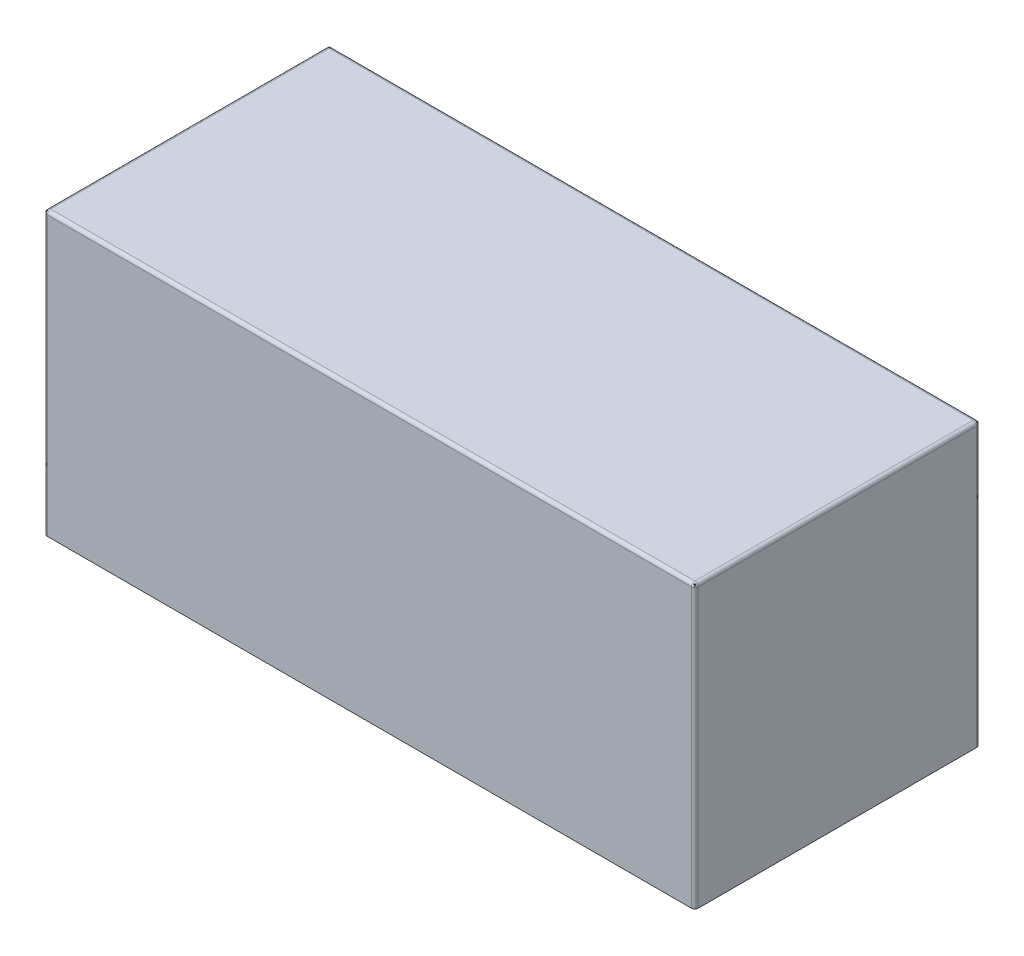
ISO-10303-21;
HEADER;
FILE_DESCRIPTION(('STEP AP214'),'2;1');
FILE_NAME('part.step','',(''),(''),'','','');
FILE_SCHEMA(('AUTOMOTIVE_DESIGN { 1 0 10303 214 1 1 1 1 }'));
ENDSEC;
DATA;
#1=APPLICATION_CONTEXT('core data for automotive mechanical design processes');
#2=APPLICATION_PROTOCOL_DEFINITION('international standard','automotive_design',2000,#1);
#3=PRODUCT_CONTEXT('',#1,'mechanical');
#4=PRODUCT('Part','Part','',(#3));
#5=PRODUCT_RELATED_PRODUCT_CATEGORY('part','',(#4));
#6=PRODUCT_DEFINITION_FORMATION('','',#4);
#7=PRODUCT_DEFINITION_CONTEXT('part definition',#1,'design');
#8=PRODUCT_DEFINITION('design','',#6,#7);
#9=PRODUCT_DEFINITION_SHAPE('','',#8);
#10=(LENGTH_UNIT() NAMED_UNIT(*) SI_UNIT(.MILLI.,.METRE.));
#11=(NAMED_UNIT(*) PLANE_ANGLE_UNIT() SI_UNIT($,.RADIAN.));
#12=(NAMED_UNIT(*) SI_UNIT($,.STERADIAN.) SOLID_ANGLE_UNIT());
#13=UNCERTAINTY_MEASURE_WITH_UNIT(LENGTH_MEASURE(1.E-05),#10,'distance_accuracy_value','');
#14=(GEOMETRIC_REPRESENTATION_CONTEXT(3) GLOBAL_UNCERTAINTY_ASSIGNED_CONTEXT((#13)) GLOBAL_UNIT_ASSIGNED_CONTEXT((#10,
#11,#12)) REPRESENTATION_CONTEXT('',''));
#15=CARTESIAN_POINT('',(0.,0.,0.));
#16=DIRECTION('',(0.,0.,1.));
#17=DIRECTION('',(1.,0.,0.));
#18=AXIS2_PLACEMENT_3D('',#15,#16,#17);
#19=CARTESIAN_POINT('',(483.4125,420.,-210.9125));
#20=DIRECTION('',(-1.,0.,0.));
#21=DIRECTION('',(0.,0.,1.));
#22=AXIS2_PLACEMENT_3D('',#19,#20,#21);
#23=PLANE('',#22);
#24=DIRECTION('',(0.,-1.,0.));
#25=VECTOR('',#24,1.);
#26=CARTESIAN_POINT('',(483.4125,420.,210.9125));
#27=LINE('',#26,#25);
#28=CARTESIAN_POINT('',(483.4125,418.4125,210.9125));
#29=VERTEX_POINT('',#28);
#30=CARTESIAN_POINT('',(483.4125,0.,210.9125));
#31=VERTEX_POINT('',#30);
#32=EDGE_CURVE('E160',#29,#31,#27,.T.);
#33=ORIENTED_EDGE('',*,*,#32,.F.);
#34=DIRECTION('',(0.,0.,-1.));
#35=VECTOR('',#34,1.);
#36=CARTESIAN_POINT('',(483.4125,418.4125,-210.9125));
#37=LINE('',#36,#35);
#38=CARTESIAN_POINT('',(483.4125,418.4125,-210.9125));
#39=VERTEX_POINT('',#38);
#40=EDGE_CURVE('E140',#29,#39,#37,.T.);
#41=ORIENTED_EDGE('',*,*,#40,.T.);
#42=DIRECTION('',(0.,-1.,0.));
#43=VECTOR('',#42,1.);
#44=CARTESIAN_POINT('',(483.4125,420.,-210.9125));
#45=LINE('',#44,#43);
#46=CARTESIAN_POINT('',(483.4125,0.,-210.9125));
#47=VERTEX_POINT('',#46);
#48=EDGE_CURVE('E162',#39,#47,#45,.T.);
#49=ORIENTED_EDGE('',*,*,#48,.T.);
#50=DIRECTION('',(0.,0.,-1.));
#51=VECTOR('',#50,1.);
#52=CARTESIAN_POINT('',(483.4125,0.,-210.9125));
#53=LINE('',#52,#51);
#54=EDGE_CURVE('E502',#31,#47,#53,.T.);
#55=ORIENTED_EDGE('',*,*,#54,.F.);
#56=EDGE_LOOP('',(#33,#41,#49,#55));
#57=FACE_BOUND('',#56,.T.);
#58=ADVANCED_FACE('F33',(#57),#23,.T.);
#59=CARTESIAN_POINT('',(-483.4125,420.,-210.9125));
#60=DIRECTION('',(0.,0.,1.));
#61=DIRECTION('',(1.,0.,0.));
#62=AXIS2_PLACEMENT_3D('',#59,#60,#61);
#63=PLANE('',#62);
#64=ORIENTED_EDGE('',*,*,#48,.F.);
#65=DIRECTION('',(-1.,0.,0.));
#66=VECTOR('',#65,1.);
#67=CARTESIAN_POINT('',(-483.4125,418.4125,-210.9125));
#68=LINE('',#67,#66);
#69=CARTESIAN_POINT('',(-483.4125,418.4125,-210.9125));
#70=VERTEX_POINT('',#69);
#71=EDGE_CURVE('E154',#39,#70,#68,.T.);
#72=ORIENTED_EDGE('',*,*,#71,.T.);
#73=DIRECTION('',(0.,-1.,0.));
#74=VECTOR('',#73,1.);
#75=CARTESIAN_POINT('',(-483.4125,420.,-210.9125));
#76=LINE('',#75,#74);
#77=CARTESIAN_POINT('',(-483.4125,0.,-210.9125));
#78=VERTEX_POINT('',#77);
#79=EDGE_CURVE('E153',#70,#78,#76,.T.);
#80=ORIENTED_EDGE('',*,*,#79,.T.);
#81=DIRECTION('',(-1.,0.,0.));
#82=VECTOR('',#81,1.);
#83=CARTESIAN_POINT('',(-483.4125,0.,-210.9125));
#84=LINE('',#83,#82);
#85=EDGE_CURVE('E505',#47,#78,#84,.T.);
#86=ORIENTED_EDGE('',*,*,#85,.F.);
#87=EDGE_LOOP('',(#64,#72,#80,#86));
#88=FACE_BOUND('',#87,.T.);
#89=ADVANCED_FACE('F314',(#88),#63,.T.);
#90=CARTESIAN_POINT('',(-483.4125,420.,-210.9125));
#91=DIRECTION('',(1.,0.,0.));
#92=DIRECTION('',(0.,0.,-1.));
#93=AXIS2_PLACEMENT_3D('',#90,#91,#92);
#94=PLANE('',#93);
#95=ORIENTED_EDGE('',*,*,#79,.F.);
#96=DIRECTION('',(0.,0.,1.));
#97=VECTOR('',#96,1.);
#98=CARTESIAN_POINT('',(-483.4125,418.4125,-210.9125));
#99=LINE('',#98,#97);
#100=CARTESIAN_POINT('',(-483.4125,418.4125,210.9125));
#101=VERTEX_POINT('',#100);
#102=EDGE_CURVE('E137',#70,#101,#99,.T.);
#103=ORIENTED_EDGE('',*,*,#102,.T.);
#104=DIRECTION('',(0.,-1.,0.));
#105=VECTOR('',#104,1.);
#106=CARTESIAN_POINT('',(-483.4125,420.,210.9125));
#107=LINE('',#106,#105);
#108=CARTESIAN_POINT('',(-483.4125,0.,210.9125));
#109=VERTEX_POINT('',#108);
#110=EDGE_CURVE('E151',#101,#109,#107,.T.);
#111=ORIENTED_EDGE('',*,*,#110,.T.);
#112=DIRECTION('',(0.,0.,1.));
#113=VECTOR('',#112,1.);
#114=CARTESIAN_POINT('',(-483.4125,0.,-210.9125));
#115=LINE('',#114,#113);
#116=EDGE_CURVE('E507',#78,#109,#115,.T.);
#117=ORIENTED_EDGE('',*,*,#116,.F.);
#118=EDGE_LOOP('',(#95,#103,#111,#117));
#119=FACE_BOUND('',#118,.T.);
#120=ADVANCED_FACE('F149',(#119),#94,.T.);
#121=CARTESIAN_POINT('',(-483.4125,420.,210.9125));
#122=DIRECTION('',(0.,0.,-1.));
#123=DIRECTION('',(-1.,0.,0.));
#124=AXIS2_PLACEMENT_3D('',#121,#122,#123);
#125=PLANE('',#124);
#126=ORIENTED_EDGE('',*,*,#110,.F.);
#127=DIRECTION('',(1.,0.,0.));
#128=VECTOR('',#127,1.);
#129=CARTESIAN_POINT('',(-483.4125,418.4125,210.9125));
#130=LINE('',#129,#128);
#131=EDGE_CURVE('E134',#101,#29,#130,.T.);
#132=ORIENTED_EDGE('',*,*,#131,.T.);
#133=ORIENTED_EDGE('',*,*,#32,.T.);
#134=DIRECTION('',(1.,0.,0.));
#135=VECTOR('',#134,1.);
#136=CARTESIAN_POINT('',(-483.4125,0.,210.9125));
#137=LINE('',#136,#135);
#138=EDGE_CURVE('E158',#109,#31,#137,.T.);
#139=ORIENTED_EDGE('',*,*,#138,.F.);
#140=EDGE_LOOP('',(#126,#132,#133,#139));
#141=FACE_BOUND('',#140,.T.);
#142=ADVANCED_FACE('F156',(#141),#125,.T.);
#143=CARTESIAN_POINT('',(0.,420.,0.));
#144=DIRECTION('',(0.,1.,0.));
#145=DIRECTION('',(0.,0.,1.));
#146=AXIS2_PLACEMENT_3D('',#143,#144,#145);
#147=PLANE('',#146);
#148=DIRECTION('',(0.,0.,1.));
#149=VECTOR('',#148,1.);
#150=CARTESIAN_POINT('',(-480.,420.,212.5));
#151=LINE('',#150,#149);
#152=CARTESIAN_POINT('',(-480.,420.,-207.5));
#153=VERTEX_POINT('',#152);
#154=CARTESIAN_POINT('',(-480.,420.,207.5));
#155=VERTEX_POINT('',#154);
#156=EDGE_CURVE('E181',#153,#155,#151,.T.);
#157=ORIENTED_EDGE('',*,*,#156,.T.);
#158=DIRECTION('',(1.,0.,0.));
#159=VECTOR('',#158,1.);
#160=CARTESIAN_POINT('',(485.,420.,207.5));
#161=LINE('',#160,#159);
#162=CARTESIAN_POINT('',(480.,420.,207.5));
#163=VERTEX_POINT('',#162);
#164=EDGE_CURVE('E183',#155,#163,#161,.T.);
#165=ORIENTED_EDGE('',*,*,#164,.T.);
#166=DIRECTION('',(0.,0.,-1.));
#167=VECTOR('',#166,1.);
#168=CARTESIAN_POINT('',(480.,420.,-212.5));
#169=LINE('',#168,#167);
#170=CARTESIAN_POINT('',(480.,420.,-207.5));
#171=VERTEX_POINT('',#170);
#172=EDGE_CURVE('E144',#163,#171,#169,.T.);
#173=ORIENTED_EDGE('',*,*,#172,.T.);
#174=DIRECTION('',(-1.,0.,0.));
#175=VECTOR('',#174,1.);
#176=CARTESIAN_POINT('',(-485.,420.,-207.5));
#177=LINE('',#176,#175);
#178=EDGE_CURVE('E179',#171,#153,#177,.T.);
#179=ORIENTED_EDGE('',*,*,#178,.T.);
#180=EDGE_LOOP('',(#157,#165,#173,#179));
#181=FACE_BOUND('',#180,.T.);
#182=ADVANCED_FACE('F260',(#181),#147,.T.);
#183=CARTESIAN_POINT('',(0.,0.,0.));
#184=DIRECTION('',(0.,1.,0.));
#185=DIRECTION('',(0.,0.,1.));
#186=AXIS2_PLACEMENT_3D('',#183,#184,#185);
#187=PLANE('',#186);
#188=DIRECTION('',(0.,0.,-1.));
#189=VECTOR('',#188,1.);
#190=CARTESIAN_POINT('',(485.,0.,-212.5));
#191=LINE('',#190,#189);
#192=CARTESIAN_POINT('',(485.,0.,207.5));
#193=VERTEX_POINT('',#192);
#194=CARTESIAN_POINT('',(485.,0.,-207.5));
#195=VERTEX_POINT('',#194);
#196=EDGE_CURVE('E168',#193,#195,#191,.T.);
#197=ORIENTED_EDGE('',*,*,#196,.F.);
#198=CARTESIAN_POINT('',(480.,0.,207.5));
#199=DIRECTION('',(0.,1.,0.));
#200=DIRECTION('',(0.,0.,1.));
#201=AXIS2_PLACEMENT_3D('',#198,#199,#200);
#202=CIRCLE('',#201,5.);
#203=CARTESIAN_POINT('',(480.,0.,212.5));
#204=VERTEX_POINT('',#203);
#205=EDGE_CURVE('E11',#193,#204,#202,.F.);
#206=ORIENTED_EDGE('',*,*,#205,.T.);
#207=DIRECTION('',(1.,0.,0.));
#208=VECTOR('',#207,1.);
#209=CARTESIAN_POINT('',(-485.,0.,212.5));
#210=LINE('',#209,#208);
#211=CARTESIAN_POINT('',(-480.,0.,212.5));
#212=VERTEX_POINT('',#211);
#213=EDGE_CURVE('E145',#212,#204,#210,.T.);
#214=ORIENTED_EDGE('',*,*,#213,.F.);
#215=CARTESIAN_POINT('',(-480.,0.,207.5));
#216=DIRECTION('',(0.,1.,0.));
#217=DIRECTION('',(0.,0.,1.));
#218=AXIS2_PLACEMENT_3D('',#215,#216,#217);
#219=CIRCLE('',#218,5.);
#220=CARTESIAN_POINT('',(-485.,0.,207.5));
#221=VERTEX_POINT('',#220);
#222=EDGE_CURVE('E42',#212,#221,#219,.F.);
#223=ORIENTED_EDGE('',*,*,#222,.T.);
#224=DIRECTION('',(0.,0.,1.));
#225=VECTOR('',#224,1.);
#226=CARTESIAN_POINT('',(-485.,0.,-212.5));
#227=LINE('',#226,#225);
#228=CARTESIAN_POINT('',(-485.,0.,-207.5));
#229=VERTEX_POINT('',#228);
#230=EDGE_CURVE('E173',#229,#221,#227,.T.);
#231=ORIENTED_EDGE('',*,*,#230,.F.);
#232=CARTESIAN_POINT('',(-480.,0.,-207.5));
#233=DIRECTION('',(0.,1.,0.));
#234=DIRECTION('',(0.,0.,1.));
#235=AXIS2_PLACEMENT_3D('',#232,#233,#234);
#236=CIRCLE('',#235,5.);
#237=CARTESIAN_POINT('',(-480.,0.,-212.5));
#238=VERTEX_POINT('',#237);
#239=EDGE_CURVE('E211',#229,#238,#236,.F.);
#240=ORIENTED_EDGE('',*,*,#239,.T.);
#241=DIRECTION('',(-1.,0.,0.));
#242=VECTOR('',#241,1.);
#243=CARTESIAN_POINT('',(-485.,0.,-212.5));
#244=LINE('',#243,#242);
#245=CARTESIAN_POINT('',(480.,0.,-212.5));
#246=VERTEX_POINT('',#245);
#247=EDGE_CURVE('E170',#246,#238,#244,.T.);
#248=ORIENTED_EDGE('',*,*,#247,.F.);
#249=CARTESIAN_POINT('',(480.,0.,-207.5));
#250=DIRECTION('',(0.,1.,0.));
#251=DIRECTION('',(0.,0.,1.));
#252=AXIS2_PLACEMENT_3D('',#249,#250,#251);
#253=CIRCLE('',#252,5.);
#254=EDGE_CURVE('E209',#246,#195,#253,.F.);
#255=ORIENTED_EDGE('',*,*,#254,.T.);
#256=EDGE_LOOP('',(#197,#206,#214,#223,#231,#240,#248,#255));
#257=FACE_BOUND('',#256,.T.);
#258=ORIENTED_EDGE('',*,*,#54,.T.);
#259=ORIENTED_EDGE('',*,*,#85,.T.);
#260=ORIENTED_EDGE('',*,*,#116,.T.);
#261=ORIENTED_EDGE('',*,*,#138,.T.);
#262=EDGE_LOOP('',(#258,#259,#260,#261));
#263=FACE_BOUND('',#262,.T.);
#264=ADVANCED_FACE('F278',(#257,#263),#187,.F.);
#265=CARTESIAN_POINT('',(485.,420.,-212.5));
#266=DIRECTION('',(-1.,0.,0.));
#267=DIRECTION('',(0.,0.,1.));
#268=AXIS2_PLACEMENT_3D('',#265,#266,#267);
#269=PLANE('',#268);
#270=DIRECTION('',(0.,0.,-1.));
#271=VECTOR('',#270,1.);
#272=CARTESIAN_POINT('',(485.,415.,212.5));
#273=LINE('',#272,#271);
#274=CARTESIAN_POINT('',(485.,415.,-207.5));
#275=VERTEX_POINT('',#274);
#276=CARTESIAN_POINT('',(485.,415.,207.5));
#277=VERTEX_POINT('',#276);
#278=EDGE_CURVE('E50',#275,#277,#273,.F.);
#279=ORIENTED_EDGE('',*,*,#278,.T.);
#280=DIRECTION('',(0.,-1.,0.));
#281=VECTOR('',#280,1.);
#282=CARTESIAN_POINT('',(485.,420.,207.5));
#283=LINE('',#282,#281);
#284=EDGE_CURVE('E207',#277,#193,#283,.T.);
#285=ORIENTED_EDGE('',*,*,#284,.T.);
#286=ORIENTED_EDGE('',*,*,#196,.T.);
#287=DIRECTION('',(0.,-1.,0.));
#288=VECTOR('',#287,1.);
#289=CARTESIAN_POINT('',(485.,420.,-207.5));
#290=LINE('',#289,#288);
#291=EDGE_CURVE('E55',#195,#275,#290,.F.);
#292=ORIENTED_EDGE('',*,*,#291,.T.);
#293=EDGE_LOOP('',(#279,#285,#286,#292));
#294=FACE_BOUND('',#293,.T.);
#295=ADVANCED_FACE('F281',(#294),#269,.F.);
#296=CARTESIAN_POINT('',(-485.,420.,-212.5));
#297=DIRECTION('',(0.,0.,1.));
#298=DIRECTION('',(1.,0.,0.));
#299=AXIS2_PLACEMENT_3D('',#296,#297,#298);
#300=PLANE('',#299);
#301=ORIENTED_EDGE('',*,*,#247,.T.);
#302=DIRECTION('',(0.,-1.,0.));
#303=VECTOR('',#302,1.);
#304=CARTESIAN_POINT('',(-480.,420.,-212.5));
#305=LINE('',#304,#303);
#306=CARTESIAN_POINT('',(-480.,415.,-212.5));
#307=VERTEX_POINT('',#306);
#308=EDGE_CURVE('E203',#238,#307,#305,.F.);
#309=ORIENTED_EDGE('',*,*,#308,.T.);
#310=DIRECTION('',(-1.,0.,0.));
#311=VECTOR('',#310,1.);
#312=CARTESIAN_POINT('',(485.,415.,-212.5));
#313=LINE('',#312,#311);
#314=CARTESIAN_POINT('',(480.,415.,-212.5));
#315=VERTEX_POINT('',#314);
#316=EDGE_CURVE('E201',#307,#315,#313,.F.);
#317=ORIENTED_EDGE('',*,*,#316,.T.);
#318=DIRECTION('',(0.,-1.,0.));
#319=VECTOR('',#318,1.);
#320=CARTESIAN_POINT('',(480.,420.,-212.5));
#321=LINE('',#320,#319);
#322=EDGE_CURVE('E199',#315,#246,#321,.T.);
#323=ORIENTED_EDGE('',*,*,#322,.T.);
#324=EDGE_LOOP('',(#301,#309,#317,#323));
#325=FACE_BOUND('',#324,.T.);
#326=ADVANCED_FACE('F270',(#325),#300,.F.);
#327=CARTESIAN_POINT('',(-485.,420.,-212.5));
#328=DIRECTION('',(1.,0.,0.));
#329=DIRECTION('',(0.,0.,-1.));
#330=AXIS2_PLACEMENT_3D('',#327,#328,#329);
#331=PLANE('',#330);
#332=ORIENTED_EDGE('',*,*,#230,.T.);
#333=DIRECTION('',(0.,-1.,0.));
#334=VECTOR('',#333,1.);
#335=CARTESIAN_POINT('',(-485.,420.,207.5));
#336=LINE('',#335,#334);
#337=CARTESIAN_POINT('',(-485.,415.,207.5));
#338=VERTEX_POINT('',#337);
#339=EDGE_CURVE('E197',#221,#338,#336,.F.);
#340=ORIENTED_EDGE('',*,*,#339,.T.);
#341=DIRECTION('',(0.,0.,1.));
#342=VECTOR('',#341,1.);
#343=CARTESIAN_POINT('',(-485.,415.,-212.5));
#344=LINE('',#343,#342);
#345=CARTESIAN_POINT('',(-485.,415.,-207.5));
#346=VERTEX_POINT('',#345);
#347=EDGE_CURVE('E195',#338,#346,#344,.F.);
#348=ORIENTED_EDGE('',*,*,#347,.T.);
#349=DIRECTION('',(0.,-1.,0.));
#350=VECTOR('',#349,1.);
#351=CARTESIAN_POINT('',(-485.,420.,-207.5));
#352=LINE('',#351,#350);
#353=EDGE_CURVE('E193',#346,#229,#352,.T.);
#354=ORIENTED_EDGE('',*,*,#353,.T.);
#355=EDGE_LOOP('',(#332,#340,#348,#354));
#356=FACE_BOUND('',#355,.T.);
#357=ADVANCED_FACE('F305',(#356),#331,.F.);
#358=CARTESIAN_POINT('',(-485.,420.,212.5));
#359=DIRECTION('',(0.,0.,-1.));
#360=DIRECTION('',(-1.,0.,0.));
#361=AXIS2_PLACEMENT_3D('',#358,#359,#360);
#362=PLANE('',#361);
#363=ORIENTED_EDGE('',*,*,#213,.T.);
#364=DIRECTION('',(0.,-1.,0.));
#365=VECTOR('',#364,1.);
#366=CARTESIAN_POINT('',(480.,420.,212.5));
#367=LINE('',#366,#365);
#368=CARTESIAN_POINT('',(480.,415.,212.5));
#369=VERTEX_POINT('',#368);
#370=EDGE_CURVE('E191',#204,#369,#367,.F.);
#371=ORIENTED_EDGE('',*,*,#370,.T.);
#372=DIRECTION('',(1.,0.,0.));
#373=VECTOR('',#372,1.);
#374=CARTESIAN_POINT('',(-485.,415.,212.5));
#375=LINE('',#374,#373);
#376=CARTESIAN_POINT('',(-480.,415.,212.5));
#377=VERTEX_POINT('',#376);
#378=EDGE_CURVE('E188',#369,#377,#375,.F.);
#379=ORIENTED_EDGE('',*,*,#378,.T.);
#380=DIRECTION('',(0.,-1.,0.));
#381=VECTOR('',#380,1.);
#382=CARTESIAN_POINT('',(-480.,420.,212.5));
#383=LINE('',#382,#381);
#384=EDGE_CURVE('E186',#377,#212,#383,.T.);
#385=ORIENTED_EDGE('',*,*,#384,.T.);
#386=EDGE_LOOP('',(#363,#371,#379,#385));
#387=FACE_BOUND('',#386,.T.);
#388=ADVANCED_FACE('F296',(#387),#362,.F.);
#389=CARTESIAN_POINT('',(0.,418.4125,0.));
#390=DIRECTION('',(0.,1.,0.));
#391=DIRECTION('',(0.,0.,1.));
#392=AXIS2_PLACEMENT_3D('',#389,#390,#391);
#393=PLANE('',#392);
#394=ORIENTED_EDGE('',*,*,#40,.F.);
#395=ORIENTED_EDGE('',*,*,#131,.F.);
#396=ORIENTED_EDGE('',*,*,#102,.F.);
#397=ORIENTED_EDGE('',*,*,#71,.F.);
#398=EDGE_LOOP('',(#394,#395,#396,#397));
#399=FACE_BOUND('',#398,.T.);
#400=ADVANCED_FACE('F136',(#399),#393,.F.);
#401=CARTESIAN_POINT('',(-480.,420.,-207.5));
#402=DIRECTION('',(0.,-1.,0.));
#403=DIRECTION('',(0.,0.,-1.));
#404=AXIS2_PLACEMENT_3D('',#401,#402,#403);
#405=CYLINDRICAL_SURFACE('',#404,5.);
#406=ORIENTED_EDGE('',*,*,#239,.F.);
#407=ORIENTED_EDGE('',*,*,#353,.F.);
#408=CARTESIAN_POINT('',(-480.,415.,-207.5));
#409=DIRECTION('',(0.,1.,0.));
#410=DIRECTION('',(0.,0.,1.));
#411=AXIS2_PLACEMENT_3D('',#408,#409,#410);
#412=CIRCLE('',#411,5.);
#413=EDGE_CURVE('E37',#307,#346,#412,.T.);
#414=ORIENTED_EDGE('',*,*,#413,.F.);
#415=ORIENTED_EDGE('',*,*,#308,.F.);
#416=EDGE_LOOP('',(#406,#407,#414,#415));
#417=FACE_BOUND('',#416,.T.);
#418=ADVANCED_FACE('F35',(#417),#405,.T.);
#419=CARTESIAN_POINT('',(0.,415.,-207.5));
#420=DIRECTION('',(1.,0.,0.));
#421=DIRECTION('',(0.,0.,-1.));
#422=AXIS2_PLACEMENT_3D('',#419,#420,#421);
#423=CYLINDRICAL_SURFACE('',#422,5.);
#424=CARTESIAN_POINT('',(480.,415.,-207.5));
#425=DIRECTION('',(1.,0.,0.));
#426=DIRECTION('',(0.,1.,0.));
#427=AXIS2_PLACEMENT_3D('',#424,#425,#426);
#428=CIRCLE('',#427,5.);
#429=EDGE_CURVE('E239',#315,#171,#428,.T.);
#430=ORIENTED_EDGE('',*,*,#429,.F.);
#431=ORIENTED_EDGE('',*,*,#316,.F.);
#432=CARTESIAN_POINT('',(-480.,415.,-207.5));
#433=DIRECTION('',(-1.,0.,0.));
#434=DIRECTION('',(0.,0.,1.));
#435=AXIS2_PLACEMENT_3D('',#432,#433,#434);
#436=CIRCLE('',#435,5.);
#437=EDGE_CURVE('E241',#153,#307,#436,.T.);
#438=ORIENTED_EDGE('',*,*,#437,.F.);
#439=ORIENTED_EDGE('',*,*,#178,.F.);
#440=EDGE_LOOP('',(#430,#431,#438,#439));
#441=FACE_BOUND('',#440,.T.);
#442=ADVANCED_FACE('F267',(#441),#423,.T.);
#443=CARTESIAN_POINT('',(480.,420.,-207.5));
#444=DIRECTION('',(0.,-1.,0.));
#445=DIRECTION('',(0.,0.,-1.));
#446=AXIS2_PLACEMENT_3D('',#443,#444,#445);
#447=CYLINDRICAL_SURFACE('',#446,5.);
#448=ORIENTED_EDGE('',*,*,#254,.F.);
#449=ORIENTED_EDGE('',*,*,#322,.F.);
#450=CARTESIAN_POINT('',(480.,415.,-207.5));
#451=DIRECTION('',(0.,1.,0.));
#452=DIRECTION('',(0.,0.,1.));
#453=AXIS2_PLACEMENT_3D('',#450,#451,#452);
#454=CIRCLE('',#453,5.);
#455=EDGE_CURVE('E236',#275,#315,#454,.T.);
#456=ORIENTED_EDGE('',*,*,#455,.F.);
#457=ORIENTED_EDGE('',*,*,#291,.F.);
#458=EDGE_LOOP('',(#448,#449,#456,#457));
#459=FACE_BOUND('',#458,.T.);
#460=ADVANCED_FACE('F274',(#459),#447,.T.);
#461=CARTESIAN_POINT('',(-480.,415.,-207.5));
#462=DIRECTION('',(0.,0.,-1.));
#463=DIRECTION('',(-1.,0.,0.));
#464=AXIS2_PLACEMENT_3D('',#461,#462,#463);
#465=SPHERICAL_SURFACE('',#464,5.);
#466=ORIENTED_EDGE('',*,*,#437,.T.);
#467=ORIENTED_EDGE('',*,*,#413,.T.);
#468=CARTESIAN_POINT('',(-480.,415.,-207.5));
#469=DIRECTION('',(0.,0.,-1.));
#470=DIRECTION('',(-1.,0.,0.));
#471=AXIS2_PLACEMENT_3D('',#468,#469,#470);
#472=CIRCLE('',#471,5.);
#473=EDGE_CURVE('E233',#153,#346,#472,.F.);
#474=ORIENTED_EDGE('',*,*,#473,.F.);
#475=EDGE_LOOP('',(#466,#467,#474));
#476=FACE_BOUND('',#475,.T.);
#477=ADVANCED_FACE('F248',(#476),#465,.T.);
#478=CARTESIAN_POINT('',(480.,415.,-207.5));
#479=DIRECTION('',(0.,0.,-1.));
#480=DIRECTION('',(-1.,0.,0.));
#481=AXIS2_PLACEMENT_3D('',#478,#479,#480);
#482=SPHERICAL_SURFACE('',#481,5.);
#483=ORIENTED_EDGE('',*,*,#455,.T.);
#484=ORIENTED_EDGE('',*,*,#429,.T.);
#485=CARTESIAN_POINT('',(480.,415.,-207.5));
#486=DIRECTION('',(0.,0.,-1.));
#487=DIRECTION('',(-1.,0.,0.));
#488=AXIS2_PLACEMENT_3D('',#485,#486,#487);
#489=CIRCLE('',#488,5.);
#490=EDGE_CURVE('E230',#275,#171,#489,.F.);
#491=ORIENTED_EDGE('',*,*,#490,.F.);
#492=EDGE_LOOP('',(#483,#484,#491));
#493=FACE_BOUND('',#492,.T.);
#494=ADVANCED_FACE('F352',(#493),#482,.T.);
#495=CARTESIAN_POINT('',(-480.,420.,207.5));
#496=DIRECTION('',(0.,-1.,0.));
#497=DIRECTION('',(0.,0.,-1.));
#498=AXIS2_PLACEMENT_3D('',#495,#496,#497);
#499=CYLINDRICAL_SURFACE('',#498,5.);
#500=ORIENTED_EDGE('',*,*,#222,.F.);
#501=ORIENTED_EDGE('',*,*,#384,.F.);
#502=CARTESIAN_POINT('',(-480.,415.,207.5));
#503=DIRECTION('',(0.,1.,0.));
#504=DIRECTION('',(0.,0.,1.));
#505=AXIS2_PLACEMENT_3D('',#502,#503,#504);
#506=CIRCLE('',#505,5.);
#507=EDGE_CURVE('E227',#338,#377,#506,.T.);
#508=ORIENTED_EDGE('',*,*,#507,.F.);
#509=ORIENTED_EDGE('',*,*,#339,.F.);
#510=EDGE_LOOP('',(#500,#501,#508,#509));
#511=FACE_BOUND('',#510,.T.);
#512=ADVANCED_FACE('F303',(#511),#499,.T.);
#513=CARTESIAN_POINT('',(-480.,415.,1.253898945459E-13));
#514=DIRECTION('',(0.,0.,-1.));
#515=DIRECTION('',(-1.,0.,0.));
#516=AXIS2_PLACEMENT_3D('',#513,#514,#515);
#517=CYLINDRICAL_SURFACE('',#516,5.);
#518=ORIENTED_EDGE('',*,*,#473,.T.);
#519=ORIENTED_EDGE('',*,*,#347,.F.);
#520=CARTESIAN_POINT('',(-480.,415.,207.5));
#521=DIRECTION('',(0.,0.,1.));
#522=DIRECTION('',(1.,0.,0.));
#523=AXIS2_PLACEMENT_3D('',#520,#521,#522);
#524=CIRCLE('',#523,5.);
#525=EDGE_CURVE('E224',#155,#338,#524,.T.);
#526=ORIENTED_EDGE('',*,*,#525,.F.);
#527=ORIENTED_EDGE('',*,*,#156,.F.);
#528=EDGE_LOOP('',(#518,#519,#526,#527));
#529=FACE_BOUND('',#528,.T.);
#530=ADVANCED_FACE('F255',(#529),#517,.T.);
#531=CARTESIAN_POINT('',(480.,415.,0.));
#532=DIRECTION('',(0.,0.,1.));
#533=DIRECTION('',(1.,0.,0.));
#534=AXIS2_PLACEMENT_3D('',#531,#532,#533);
#535=CYLINDRICAL_SURFACE('',#534,5.);
#536=ORIENTED_EDGE('',*,*,#490,.T.);
#537=ORIENTED_EDGE('',*,*,#172,.F.);
#538=CARTESIAN_POINT('',(480.,415.,207.5));
#539=DIRECTION('',(0.,0.,1.));
#540=DIRECTION('',(1.,0.,0.));
#541=AXIS2_PLACEMENT_3D('',#538,#539,#540);
#542=CIRCLE('',#541,5.);
#543=EDGE_CURVE('E221',#277,#163,#542,.T.);
#544=ORIENTED_EDGE('',*,*,#543,.F.);
#545=ORIENTED_EDGE('',*,*,#278,.F.);
#546=EDGE_LOOP('',(#536,#537,#544,#545));
#547=FACE_BOUND('',#546,.T.);
#548=ADVANCED_FACE('F289',(#547),#535,.T.);
#549=CARTESIAN_POINT('',(480.,420.,207.5));
#550=DIRECTION('',(0.,-1.,0.));
#551=DIRECTION('',(0.,0.,-1.));
#552=AXIS2_PLACEMENT_3D('',#549,#550,#551);
#553=CYLINDRICAL_SURFACE('',#552,5.);
#554=ORIENTED_EDGE('',*,*,#205,.F.);
#555=ORIENTED_EDGE('',*,*,#284,.F.);
#556=CARTESIAN_POINT('',(480.,415.,207.5));
#557=DIRECTION('',(0.,1.,0.));
#558=DIRECTION('',(0.,0.,1.));
#559=AXIS2_PLACEMENT_3D('',#556,#557,#558);
#560=CIRCLE('',#559,5.);
#561=EDGE_CURVE('E218',#369,#277,#560,.T.);
#562=ORIENTED_EDGE('',*,*,#561,.F.);
#563=ORIENTED_EDGE('',*,*,#370,.F.);
#564=EDGE_LOOP('',(#554,#555,#562,#563));
#565=FACE_BOUND('',#564,.T.);
#566=ADVANCED_FACE('F285',(#565),#553,.T.);
#567=CARTESIAN_POINT('',(-480.,415.,207.5));
#568=DIRECTION('',(-1.,0.,0.));
#569=DIRECTION('',(0.,0.,1.));
#570=AXIS2_PLACEMENT_3D('',#567,#568,#569);
#571=SPHERICAL_SURFACE('',#570,5.);
#572=ORIENTED_EDGE('',*,*,#525,.T.);
#573=ORIENTED_EDGE('',*,*,#507,.T.);
#574=CARTESIAN_POINT('',(-480.,415.,207.5));
#575=DIRECTION('',(-1.,0.,0.));
#576=DIRECTION('',(0.,0.,1.));
#577=AXIS2_PLACEMENT_3D('',#574,#575,#576);
#578=CIRCLE('',#577,5.);
#579=EDGE_CURVE('E216',#155,#377,#578,.F.);
#580=ORIENTED_EDGE('',*,*,#579,.F.);
#581=EDGE_LOOP('',(#572,#573,#580));
#582=FACE_BOUND('',#581,.T.);
#583=ADVANCED_FACE('F340',(#582),#571,.T.);
#584=CARTESIAN_POINT('',(480.,415.,207.5));
#585=DIRECTION('',(1.,0.,0.));
#586=DIRECTION('',(0.,0.,-1.));
#587=AXIS2_PLACEMENT_3D('',#584,#585,#586);
#588=SPHERICAL_SURFACE('',#587,5.);
#589=ORIENTED_EDGE('',*,*,#561,.T.);
#590=ORIENTED_EDGE('',*,*,#543,.T.);
#591=CARTESIAN_POINT('',(480.,415.,207.5));
#592=DIRECTION('',(1.,0.,0.));
#593=DIRECTION('',(0.,0.,-1.));
#594=AXIS2_PLACEMENT_3D('',#591,#592,#593);
#595=CIRCLE('',#594,5.);
#596=EDGE_CURVE('E214',#369,#163,#595,.F.);
#597=ORIENTED_EDGE('',*,*,#596,.F.);
#598=EDGE_LOOP('',(#589,#590,#597));
#599=FACE_BOUND('',#598,.T.);
#600=ADVANCED_FACE('F292',(#599),#588,.T.);
#601=CARTESIAN_POINT('',(0.,415.,207.5));
#602=DIRECTION('',(-1.,0.,0.));
#603=DIRECTION('',(0.,0.,1.));
#604=AXIS2_PLACEMENT_3D('',#601,#602,#603);
#605=CYLINDRICAL_SURFACE('',#604,5.);
#606=ORIENTED_EDGE('',*,*,#579,.T.);
#607=ORIENTED_EDGE('',*,*,#378,.F.);
#608=ORIENTED_EDGE('',*,*,#596,.T.);
#609=ORIENTED_EDGE('',*,*,#164,.F.);
#610=EDGE_LOOP('',(#606,#607,#608,#609));
#611=FACE_BOUND('',#610,.T.);
#612=ADVANCED_FACE('F294',(#611),#605,.T.);
#613=CLOSED_SHELL('',(#58,#89,#120,#142,#182,#264,#295,#326,#357,#388,#400,#418,#442,#460,#477,
#494,#512,#530,#548,#566,#583,#600,#612));
#614=MANIFOLD_SOLID_BREP('B2',#613);
#615=ADVANCED_BREP_SHAPE_REPRESENTATION('',(#18,#614),#14);
#616=SHAPE_DEFINITION_REPRESENTATION(#9,#615);
ENDSEC;
END-ISO-10303-21;
